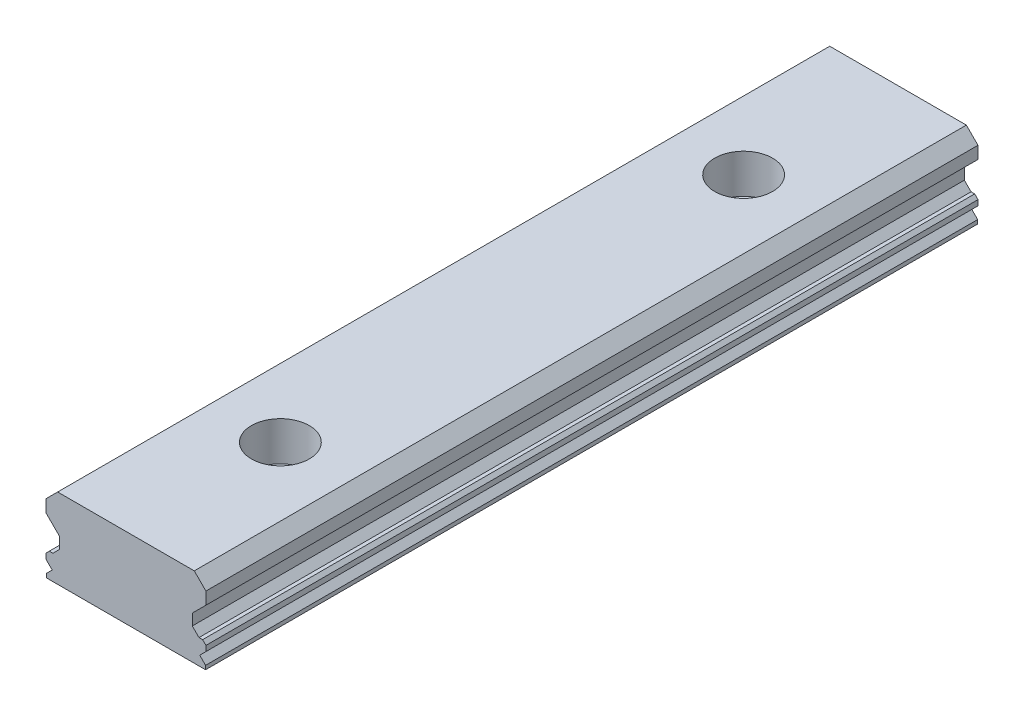
ISO-10303-21;
HEADER;
FILE_DESCRIPTION(('STEP AP214'),'2;1');
FILE_NAME('part.step','',(''),(''),'','','');
FILE_SCHEMA(('AUTOMOTIVE_DESIGN { 1 0 10303 214 1 1 1 1 }'));
ENDSEC;
DATA;
#1=APPLICATION_CONTEXT('core data for automotive mechanical design processes');
#2=APPLICATION_PROTOCOL_DEFINITION('international standard','automotive_design',2000,#1);
#3=PRODUCT_CONTEXT('',#1,'mechanical');
#4=PRODUCT('Part','Part','',(#3));
#5=PRODUCT_RELATED_PRODUCT_CATEGORY('part','',(#4));
#6=PRODUCT_DEFINITION_FORMATION('','',#4);
#7=PRODUCT_DEFINITION_CONTEXT('part definition',#1,'design');
#8=PRODUCT_DEFINITION('design','',#6,#7);
#9=PRODUCT_DEFINITION_SHAPE('','',#8);
#10=(LENGTH_UNIT() NAMED_UNIT(*) SI_UNIT(.MILLI.,.METRE.));
#11=(NAMED_UNIT(*) PLANE_ANGLE_UNIT() SI_UNIT($,.RADIAN.));
#12=(NAMED_UNIT(*) SI_UNIT($,.STERADIAN.) SOLID_ANGLE_UNIT());
#13=UNCERTAINTY_MEASURE_WITH_UNIT(LENGTH_MEASURE(1.E-05),#10,'distance_accuracy_value','');
#14=(GEOMETRIC_REPRESENTATION_CONTEXT(3) GLOBAL_UNCERTAINTY_ASSIGNED_CONTEXT((#13)) GLOBAL_UNIT_ASSIGNED_CONTEXT((#10,
#11,#12)) REPRESENTATION_CONTEXT('',''));
#15=CARTESIAN_POINT('',(0.,0.,0.));
#16=DIRECTION('',(0.,0.,1.));
#17=DIRECTION('',(1.,0.,0.));
#18=AXIS2_PLACEMENT_3D('',#15,#16,#17);
#19=CARTESIAN_POINT('',(-10.3131559924218,-5.07905707397295,100.));
#20=DIRECTION('',(0.,1.,0.));
#21=DIRECTION('',(0.,0.,1.));
#22=AXIS2_PLACEMENT_3D('',#19,#20,#21);
#23=PLANE('',#22);
#24=CARTESIAN_POINT('',(0.,-5.07905707397295,20.));
#25=DIRECTION('',(0.,1.,0.));
#26=DIRECTION('',(0.,0.,1.));
#27=AXIS2_PLACEMENT_3D('',#24,#25,#26);
#28=CIRCLE('',#27,2.25);
#29=CARTESIAN_POINT('',(0.,-5.07905707397295,22.25));
#30=VERTEX_POINT('',#29);
#31=EDGE_CURVE('E421',#30,#30,#28,.T.);
#32=ORIENTED_EDGE('',*,*,#31,.T.);
#33=EDGE_LOOP('',(#32));
#34=FACE_BOUND('',#33,.T.);
#35=CARTESIAN_POINT('',(0.,-5.07905707397295,80.));
#36=DIRECTION('',(0.,1.,0.));
#37=DIRECTION('',(0.,0.,1.));
#38=AXIS2_PLACEMENT_3D('',#35,#36,#37);
#39=CIRCLE('',#38,2.25);
#40=CARTESIAN_POINT('',(0.,-5.07905707397295,82.25));
#41=VERTEX_POINT('',#40);
#42=EDGE_CURVE('E424',#41,#41,#39,.T.);
#43=ORIENTED_EDGE('',*,*,#42,.T.);
#44=EDGE_LOOP('',(#43));
#45=FACE_BOUND('',#44,.T.);
#46=DIRECTION('',(1.,0.,0.));
#47=VECTOR('',#46,1.);
#48=CARTESIAN_POINT('',(-10.3131559924218,-5.07905707397295,0.));
#49=LINE('',#48,#47);
#50=CARTESIAN_POINT('',(-10.3131559924218,-5.07905707397295,0.));
#51=VERTEX_POINT('',#50);
#52=CARTESIAN_POINT('',(10.3131559924218,-5.07905707397295,0.));
#53=VERTEX_POINT('',#52);
#54=EDGE_CURVE('E228',#51,#53,#49,.T.);
#55=ORIENTED_EDGE('',*,*,#54,.T.);
#56=DIRECTION('',(0.,0.,-1.));
#57=VECTOR('',#56,1.);
#58=CARTESIAN_POINT('',(10.3131559924218,-5.07905707397295,100.));
#59=LINE('',#58,#57);
#60=CARTESIAN_POINT('',(10.3131559924218,-5.07905707397295,100.));
#61=VERTEX_POINT('',#60);
#62=EDGE_CURVE('E12',#61,#53,#59,.T.);
#63=ORIENTED_EDGE('',*,*,#62,.F.);
#64=DIRECTION('',(1.,0.,0.));
#65=VECTOR('',#64,1.);
#66=CARTESIAN_POINT('',(-10.3131559924218,-5.07905707397295,100.));
#67=LINE('',#66,#65);
#68=CARTESIAN_POINT('',(-10.3131559924218,-5.07905707397295,100.));
#69=VERTEX_POINT('',#68);
#70=EDGE_CURVE('E275',#69,#61,#67,.T.);
#71=ORIENTED_EDGE('',*,*,#70,.F.);
#72=DIRECTION('',(0.,0.,-1.));
#73=VECTOR('',#72,1.);
#74=CARTESIAN_POINT('',(-10.3131559924218,-5.07905707397295,100.));
#75=LINE('',#74,#73);
#76=EDGE_CURVE('E224',#69,#51,#75,.T.);
#77=ORIENTED_EDGE('',*,*,#76,.T.);
#78=EDGE_LOOP('',(#55,#63,#71,#77));
#79=FACE_BOUND('',#78,.T.);
#80=ADVANCED_FACE('F36',(#34,#45,#79),#23,.F.);
#81=CARTESIAN_POINT('',(10.3131559924218,-5.07905707397295,100.));
#82=DIRECTION('',(-1.,0.,0.));
#83=DIRECTION('',(0.,0.,1.));
#84=AXIS2_PLACEMENT_3D('',#81,#82,#83);
#85=PLANE('',#84);
#86=DIRECTION('',(0.,1.,0.));
#87=VECTOR('',#86,1.);
#88=CARTESIAN_POINT('',(10.3131559924218,-5.07905707397295,0.));
#89=LINE('',#88,#87);
#90=CARTESIAN_POINT('',(10.3131559924218,-4.57905707397295,0.));
#91=VERTEX_POINT('',#90);
#92=EDGE_CURVE('E231',#53,#91,#89,.T.);
#93=ORIENTED_EDGE('',*,*,#92,.T.);
#94=DIRECTION('',(0.,0.,-1.));
#95=VECTOR('',#94,1.);
#96=CARTESIAN_POINT('',(10.3131559924218,-4.57905707397295,100.));
#97=LINE('',#96,#95);
#98=CARTESIAN_POINT('',(10.3131559924218,-4.57905707397295,100.));
#99=VERTEX_POINT('',#98);
#100=EDGE_CURVE('E44',#99,#91,#97,.T.);
#101=ORIENTED_EDGE('',*,*,#100,.F.);
#102=DIRECTION('',(0.,1.,0.));
#103=VECTOR('',#102,1.);
#104=CARTESIAN_POINT('',(10.3131559924218,-5.07905707397295,100.));
#105=LINE('',#104,#103);
#106=EDGE_CURVE('E143',#61,#99,#105,.T.);
#107=ORIENTED_EDGE('',*,*,#106,.F.);
#108=ORIENTED_EDGE('',*,*,#62,.T.);
#109=EDGE_LOOP('',(#93,#101,#107,#108));
#110=FACE_BOUND('',#109,.T.);
#111=ADVANCED_FACE('F413',(#110),#85,.F.);
#112=CARTESIAN_POINT('',(10.3131559924218,-4.57905707397295,100.));
#113=DIRECTION('',(-0.707106781186549,-0.707106781186546,0.));
#114=DIRECTION('',(0.707106781186546,-0.707106781186549,0.));
#115=AXIS2_PLACEMENT_3D('',#112,#113,#114);
#116=PLANE('',#115);
#117=DIRECTION('',(-0.707106781186546,0.707106781186549,0.));
#118=VECTOR('',#117,1.);
#119=CARTESIAN_POINT('',(10.3131559924218,-4.57905707397295,0.));
#120=LINE('',#119,#118);
#121=CARTESIAN_POINT('',(9.55425294620379,-3.82015402775489,0.));
#122=VERTEX_POINT('',#121);
#123=EDGE_CURVE('E234',#91,#122,#120,.T.);
#124=ORIENTED_EDGE('',*,*,#123,.T.);
#125=DIRECTION('',(0.,0.,-1.));
#126=VECTOR('',#125,1.);
#127=CARTESIAN_POINT('',(9.55425294620379,-3.82015402775489,100.));
#128=LINE('',#127,#126);
#129=CARTESIAN_POINT('',(9.55425294620379,-3.82015402775489,100.));
#130=VERTEX_POINT('',#129);
#131=EDGE_CURVE('E330',#130,#122,#128,.T.);
#132=ORIENTED_EDGE('',*,*,#131,.F.);
#133=DIRECTION('',(-0.707106781186546,0.707106781186549,0.));
#134=VECTOR('',#133,1.);
#135=CARTESIAN_POINT('',(10.3131559924218,-4.57905707397295,100.));
#136=LINE('',#135,#134);
#137=EDGE_CURVE('E338',#99,#130,#136,.T.);
#138=ORIENTED_EDGE('',*,*,#137,.F.);
#139=ORIENTED_EDGE('',*,*,#100,.T.);
#140=EDGE_LOOP('',(#124,#132,#138,#139));
#141=FACE_BOUND('',#140,.T.);
#142=ADVANCED_FACE('F336',(#141),#116,.F.);
#143=CARTESIAN_POINT('',(9.55425294620379,-3.82015402775489,100.));
#144=DIRECTION('',(-0.707106781186548,0.707106781186547,0.));
#145=DIRECTION('',(-0.707106781186547,-0.707106781186548,0.));
#146=AXIS2_PLACEMENT_3D('',#143,#144,#145);
#147=PLANE('',#146);
#148=DIRECTION('',(0.707106781186547,0.707106781186548,0.));
#149=VECTOR('',#148,1.);
#150=CARTESIAN_POINT('',(9.55425294620379,-3.82015402775489,0.));
#151=LINE('',#150,#149);
#152=CARTESIAN_POINT('',(10.3561460451527,-3.01826092880601,0.));
#153=VERTEX_POINT('',#152);
#154=EDGE_CURVE('E236',#122,#153,#151,.T.);
#155=ORIENTED_EDGE('',*,*,#154,.T.);
#156=DIRECTION('',(0.,0.,-1.));
#157=VECTOR('',#156,1.);
#158=CARTESIAN_POINT('',(10.3561460451527,-3.01826092880601,100.));
#159=LINE('',#158,#157);
#160=CARTESIAN_POINT('',(10.3561460451527,-3.01826092880601,100.));
#161=VERTEX_POINT('',#160);
#162=EDGE_CURVE('E327',#161,#153,#159,.T.);
#163=ORIENTED_EDGE('',*,*,#162,.F.);
#164=DIRECTION('',(0.707106781186547,0.707106781186548,0.));
#165=VECTOR('',#164,1.);
#166=CARTESIAN_POINT('',(9.55425294620379,-3.82015402775489,100.));
#167=LINE('',#166,#165);
#168=EDGE_CURVE('E356',#130,#161,#167,.T.);
#169=ORIENTED_EDGE('',*,*,#168,.F.);
#170=ORIENTED_EDGE('',*,*,#131,.T.);
#171=EDGE_LOOP('',(#155,#163,#169,#170));
#172=FACE_BOUND('',#171,.T.);
#173=ADVANCED_FACE('F347',(#172),#147,.F.);
#174=CARTESIAN_POINT('',(10.3561460451527,-3.01826092880601,100.));
#175=DIRECTION('',(-1.,0.,0.));
#176=DIRECTION('',(0.,0.,1.));
#177=AXIS2_PLACEMENT_3D('',#174,#175,#176);
#178=PLANE('',#177);
#179=DIRECTION('',(0.,1.,0.));
#180=VECTOR('',#179,1.);
#181=CARTESIAN_POINT('',(10.3561460451527,-3.01826092880601,0.));
#182=LINE('',#181,#180);
#183=CARTESIAN_POINT('',(10.3561460451527,-2.32063772826459,0.));
#184=VERTEX_POINT('',#183);
#185=EDGE_CURVE('E238',#153,#184,#182,.T.);
#186=ORIENTED_EDGE('',*,*,#185,.T.);
#187=DIRECTION('',(0.,0.,-1.));
#188=VECTOR('',#187,1.);
#189=CARTESIAN_POINT('',(10.3561460451527,-2.32063772826459,100.));
#190=LINE('',#189,#188);
#191=CARTESIAN_POINT('',(10.3561460451527,-2.32063772826459,100.));
#192=VERTEX_POINT('',#191);
#193=EDGE_CURVE('E324',#192,#184,#190,.T.);
#194=ORIENTED_EDGE('',*,*,#193,.F.);
#195=DIRECTION('',(0.,1.,0.));
#196=VECTOR('',#195,1.);
#197=CARTESIAN_POINT('',(10.3561460451527,-3.01826092880601,100.));
#198=LINE('',#197,#196);
#199=EDGE_CURVE('E353',#161,#192,#198,.T.);
#200=ORIENTED_EDGE('',*,*,#199,.F.);
#201=ORIENTED_EDGE('',*,*,#162,.T.);
#202=EDGE_LOOP('',(#186,#194,#200,#201));
#203=FACE_BOUND('',#202,.T.);
#204=ADVANCED_FACE('F351',(#203),#178,.F.);
#205=CARTESIAN_POINT('',(10.3561460451527,-2.32063772826459,100.));
#206=DIRECTION('',(-0.707106781186546,-0.707106781186549,0.));
#207=DIRECTION('',(0.707106781186549,-0.707106781186546,0.));
#208=AXIS2_PLACEMENT_3D('',#205,#206,#207);
#209=PLANE('',#208);
#210=DIRECTION('',(-0.707106781186549,0.707106781186546,0.));
#211=VECTOR('',#210,1.);
#212=CARTESIAN_POINT('',(10.3561460451527,-2.32063772826459,0.));
#213=LINE('',#212,#211);
#214=CARTESIAN_POINT('',(9.92749896890732,-1.89199065201925,0.));
#215=VERTEX_POINT('',#214);
#216=EDGE_CURVE('E240',#184,#215,#213,.T.);
#217=ORIENTED_EDGE('',*,*,#216,.T.);
#218=DIRECTION('',(0.,0.,-1.));
#219=VECTOR('',#218,1.);
#220=CARTESIAN_POINT('',(9.92749896890732,-1.89199065201925,100.));
#221=LINE('',#220,#219);
#222=CARTESIAN_POINT('',(9.92749896890732,-1.89199065201925,100.));
#223=VERTEX_POINT('',#222);
#224=EDGE_CURVE('E321',#223,#215,#221,.T.);
#225=ORIENTED_EDGE('',*,*,#224,.F.);
#226=DIRECTION('',(-0.707106781186549,0.707106781186546,0.));
#227=VECTOR('',#226,1.);
#228=CARTESIAN_POINT('',(10.3561460451527,-2.32063772826459,100.));
#229=LINE('',#228,#227);
#230=EDGE_CURVE('E355',#192,#223,#229,.T.);
#231=ORIENTED_EDGE('',*,*,#230,.F.);
#232=ORIENTED_EDGE('',*,*,#193,.T.);
#233=EDGE_LOOP('',(#217,#225,#231,#232));
#234=FACE_BOUND('',#233,.T.);
#235=ADVANCED_FACE('F591',(#234),#209,.F.);
#236=CARTESIAN_POINT('',(9.92749896890732,-1.89199065201925,100.));
#237=DIRECTION('',(0.,-1.,0.));
#238=DIRECTION('',(0.,0.,-1.));
#239=AXIS2_PLACEMENT_3D('',#236,#237,#238);
#240=PLANE('',#239);
#241=DIRECTION('',(-1.,0.,0.));
#242=VECTOR('',#241,1.);
#243=CARTESIAN_POINT('',(9.92749896890732,-1.89199065201925,0.));
#244=LINE('',#243,#242);
#245=CARTESIAN_POINT('',(9.45946662844144,-1.89199065201925,0.));
#246=VERTEX_POINT('',#245);
#247=EDGE_CURVE('E242',#215,#246,#244,.T.);
#248=ORIENTED_EDGE('',*,*,#247,.T.);
#249=DIRECTION('',(0.,0.,-1.));
#250=VECTOR('',#249,1.);
#251=CARTESIAN_POINT('',(9.45946662844144,-1.89199065201925,100.));
#252=LINE('',#251,#250);
#253=CARTESIAN_POINT('',(9.45946662844144,-1.89199065201925,100.));
#254=VERTEX_POINT('',#253);
#255=EDGE_CURVE('E318',#254,#246,#252,.T.);
#256=ORIENTED_EDGE('',*,*,#255,.F.);
#257=DIRECTION('',(-1.,0.,0.));
#258=VECTOR('',#257,1.);
#259=CARTESIAN_POINT('',(9.92749896890732,-1.89199065201925,100.));
#260=LINE('',#259,#258);
#261=EDGE_CURVE('E358',#223,#254,#260,.T.);
#262=ORIENTED_EDGE('',*,*,#261,.F.);
#263=ORIENTED_EDGE('',*,*,#224,.T.);
#264=EDGE_LOOP('',(#248,#256,#262,#263));
#265=FACE_BOUND('',#264,.T.);
#266=ADVANCED_FACE('F588',(#265),#240,.F.);
#267=CARTESIAN_POINT('',(9.45946662844144,-1.89199065201925,100.));
#268=DIRECTION('',(-0.707106781186549,-0.707106781186547,0.));
#269=DIRECTION('',(0.707106781186547,-0.707106781186549,0.));
#270=AXIS2_PLACEMENT_3D('',#267,#268,#269);
#271=PLANE('',#270);
#272=DIRECTION('',(-0.707106781186546,0.707106781186549,0.));
#273=VECTOR('',#272,1.);
#274=CARTESIAN_POINT('',(9.45946662844144,-1.89199065201925,0.));
#275=LINE('',#274,#273);
#276=CARTESIAN_POINT('',(8.5918670125414,-1.0243910361192,0.));
#277=VERTEX_POINT('',#276);
#278=EDGE_CURVE('E244',#246,#277,#275,.T.);
#279=ORIENTED_EDGE('',*,*,#278,.T.);
#280=DIRECTION('',(0.,0.,-1.));
#281=VECTOR('',#280,1.);
#282=CARTESIAN_POINT('',(8.5918670125414,-1.0243910361192,100.));
#283=LINE('',#282,#281);
#284=CARTESIAN_POINT('',(8.5918670125414,-1.0243910361192,100.));
#285=VERTEX_POINT('',#284);
#286=EDGE_CURVE('E315',#285,#277,#283,.T.);
#287=ORIENTED_EDGE('',*,*,#286,.F.);
#288=DIRECTION('',(-0.707106781186546,0.707106781186549,0.));
#289=VECTOR('',#288,1.);
#290=CARTESIAN_POINT('',(9.45946662844144,-1.89199065201925,100.));
#291=LINE('',#290,#289);
#292=EDGE_CURVE('E364',#254,#285,#291,.T.);
#293=ORIENTED_EDGE('',*,*,#292,.F.);
#294=ORIENTED_EDGE('',*,*,#255,.T.);
#295=EDGE_LOOP('',(#279,#287,#293,#294));
#296=FACE_BOUND('',#295,.T.);
#297=ADVANCED_FACE('F583',(#296),#271,.F.);
#298=CARTESIAN_POINT('',(8.5918670125414,-1.0243910361192,100.));
#299=DIRECTION('',(-1.,0.,0.));
#300=DIRECTION('',(0.,0.,1.));
#301=AXIS2_PLACEMENT_3D('',#298,#299,#300);
#302=PLANE('',#301);
#303=DIRECTION('',(0.,1.,0.));
#304=VECTOR('',#303,1.);
#305=CARTESIAN_POINT('',(8.5918670125414,-1.0243910361192,0.));
#306=LINE('',#305,#304);
#307=CARTESIAN_POINT('',(8.5918670125414,0.420032400687811,0.));
#308=VERTEX_POINT('',#307);
#309=EDGE_CURVE('E246',#277,#308,#306,.T.);
#310=ORIENTED_EDGE('',*,*,#309,.T.);
#311=DIRECTION('',(0.,0.,-1.));
#312=VECTOR('',#311,1.);
#313=CARTESIAN_POINT('',(8.5918670125414,0.420032400687811,100.));
#314=LINE('',#313,#312);
#315=CARTESIAN_POINT('',(8.5918670125414,0.420032400687811,100.));
#316=VERTEX_POINT('',#315);
#317=EDGE_CURVE('E312',#316,#308,#314,.T.);
#318=ORIENTED_EDGE('',*,*,#317,.F.);
#319=DIRECTION('',(0.,1.,0.));
#320=VECTOR('',#319,1.);
#321=CARTESIAN_POINT('',(8.5918670125414,-1.0243910361192,100.));
#322=LINE('',#321,#320);
#323=EDGE_CURVE('E366',#285,#316,#322,.T.);
#324=ORIENTED_EDGE('',*,*,#323,.F.);
#325=ORIENTED_EDGE('',*,*,#286,.T.);
#326=EDGE_LOOP('',(#310,#318,#324,#325));
#327=FACE_BOUND('',#326,.T.);
#328=ADVANCED_FACE('F578',(#327),#302,.F.);
#329=CARTESIAN_POINT('',(8.5918670125414,0.420032400687811,100.));
#330=DIRECTION('',(-0.707106781186547,0.707106781186548,0.));
#331=DIRECTION('',(-0.707106781186548,-0.707106781186547,0.));
#332=AXIS2_PLACEMENT_3D('',#329,#330,#331);
#333=PLANE('',#332);
#334=DIRECTION('',(0.707106781186548,0.707106781186547,0.));
#335=VECTOR('',#334,1.);
#336=CARTESIAN_POINT('',(8.5918670125414,0.420032400687811,0.));
#337=LINE('',#336,#335);
#338=CARTESIAN_POINT('',(10.3561460451527,2.18431143329908,0.));
#339=VERTEX_POINT('',#338);
#340=EDGE_CURVE('E248',#308,#339,#337,.T.);
#341=ORIENTED_EDGE('',*,*,#340,.T.);
#342=DIRECTION('',(0.,0.,-1.));
#343=VECTOR('',#342,1.);
#344=CARTESIAN_POINT('',(10.3561460451527,2.18431143329908,100.));
#345=LINE('',#344,#343);
#346=CARTESIAN_POINT('',(10.3561460451527,2.18431143329908,100.));
#347=VERTEX_POINT('',#346);
#348=EDGE_CURVE('E309',#347,#339,#345,.T.);
#349=ORIENTED_EDGE('',*,*,#348,.F.);
#350=DIRECTION('',(0.707106781186548,0.707106781186547,0.));
#351=VECTOR('',#350,1.);
#352=CARTESIAN_POINT('',(8.5918670125414,0.420032400687811,100.));
#353=LINE('',#352,#351);
#354=EDGE_CURVE('E368',#316,#347,#353,.T.);
#355=ORIENTED_EDGE('',*,*,#354,.F.);
#356=ORIENTED_EDGE('',*,*,#317,.T.);
#357=EDGE_LOOP('',(#341,#349,#355,#356));
#358=FACE_BOUND('',#357,.T.);
#359=ADVANCED_FACE('F574',(#358),#333,.F.);
#360=CARTESIAN_POINT('',(10.3561460451527,2.18431143329908,100.));
#361=DIRECTION('',(-1.,0.,0.));
#362=DIRECTION('',(0.,-1.,0.));
#363=AXIS2_PLACEMENT_3D('',#360,#361,#362);
#364=PLANE('',#363);
#365=DIRECTION('',(0.,1.,0.));
#366=VECTOR('',#365,1.);
#367=CARTESIAN_POINT('',(10.3561460451527,2.18431143329908,0.));
#368=LINE('',#367,#366);
#369=CARTESIAN_POINT('',(10.3561460451527,3.77672605578153,0.));
#370=VERTEX_POINT('',#369);
#371=EDGE_CURVE('E250',#339,#370,#368,.T.);
#372=ORIENTED_EDGE('',*,*,#371,.T.);
#373=DIRECTION('',(0.,0.,-1.));
#374=VECTOR('',#373,1.);
#375=CARTESIAN_POINT('',(10.3561460451527,3.77672605578153,100.));
#376=LINE('',#375,#374);
#377=CARTESIAN_POINT('',(10.3561460451527,3.77672605578153,100.));
#378=VERTEX_POINT('',#377);
#379=EDGE_CURVE('E306',#378,#370,#376,.T.);
#380=ORIENTED_EDGE('',*,*,#379,.F.);
#381=DIRECTION('',(0.,1.,0.));
#382=VECTOR('',#381,1.);
#383=CARTESIAN_POINT('',(10.3561460451527,2.18431143329908,100.));
#384=LINE('',#383,#382);
#385=EDGE_CURVE('E370',#347,#378,#384,.T.);
#386=ORIENTED_EDGE('',*,*,#385,.F.);
#387=ORIENTED_EDGE('',*,*,#348,.T.);
#388=EDGE_LOOP('',(#372,#380,#386,#387));
#389=FACE_BOUND('',#388,.T.);
#390=ADVANCED_FACE('F570',(#389),#364,.F.);
#391=CARTESIAN_POINT('',(10.3561460451527,3.77672605578153,100.));
#392=DIRECTION('',(-0.707106781186548,-0.707106781186547,0.));
#393=DIRECTION('',(0.707106781186547,-0.707106781186548,0.));
#394=AXIS2_PLACEMENT_3D('',#391,#392,#393);
#395=PLANE('',#394);
#396=DIRECTION('',(-0.707106781186547,0.707106781186548,0.));
#397=VECTOR('',#396,1.);
#398=CARTESIAN_POINT('',(10.3561460451527,3.77672605578153,0.));
#399=LINE('',#398,#397);
#400=CARTESIAN_POINT('',(8.84781244645144,5.28505965448277,0.));
#401=VERTEX_POINT('',#400);
#402=EDGE_CURVE('E252',#370,#401,#399,.T.);
#403=ORIENTED_EDGE('',*,*,#402,.T.);
#404=DIRECTION('',(0.,0.,-1.));
#405=VECTOR('',#404,1.);
#406=CARTESIAN_POINT('',(8.84781244645144,5.28505965448277,100.));
#407=LINE('',#406,#405);
#408=CARTESIAN_POINT('',(8.84781244645144,5.28505965448277,100.));
#409=VERTEX_POINT('',#408);
#410=EDGE_CURVE('E303',#409,#401,#407,.T.);
#411=ORIENTED_EDGE('',*,*,#410,.F.);
#412=DIRECTION('',(-0.707106781186547,0.707106781186548,0.));
#413=VECTOR('',#412,1.);
#414=CARTESIAN_POINT('',(10.3561460451527,3.77672605578153,100.));
#415=LINE('',#414,#413);
#416=EDGE_CURVE('E372',#378,#409,#415,.T.);
#417=ORIENTED_EDGE('',*,*,#416,.F.);
#418=ORIENTED_EDGE('',*,*,#379,.T.);
#419=EDGE_LOOP('',(#403,#411,#417,#418));
#420=FACE_BOUND('',#419,.T.);
#421=ADVANCED_FACE('F536',(#420),#395,.F.);
#422=CARTESIAN_POINT('',(8.84781244645144,5.28505965448277,100.));
#423=DIRECTION('',(0.,-1.,0.));
#424=DIRECTION('',(0.,0.,-1.));
#425=AXIS2_PLACEMENT_3D('',#422,#423,#424);
#426=PLANE('',#425);
#427=CARTESIAN_POINT('',(0.,5.28505965448277,20.));
#428=DIRECTION('',(0.,1.,0.));
#429=DIRECTION('',(0.,0.,1.));
#430=AXIS2_PLACEMENT_3D('',#427,#428,#429);
#431=CIRCLE('',#430,3.75);
#432=CARTESIAN_POINT('',(0.,5.28505965448277,23.75));
#433=VERTEX_POINT('',#432);
#434=EDGE_CURVE('E435',#433,#433,#431,.T.);
#435=ORIENTED_EDGE('',*,*,#434,.F.);
#436=EDGE_LOOP('',(#435));
#437=FACE_BOUND('',#436,.T.);
#438=CARTESIAN_POINT('',(0.,5.28505965448277,80.));
#439=DIRECTION('',(0.,1.,0.));
#440=DIRECTION('',(0.,0.,1.));
#441=AXIS2_PLACEMENT_3D('',#438,#439,#440);
#442=CIRCLE('',#441,3.75);
#443=CARTESIAN_POINT('',(0.,5.28505965448277,83.75));
#444=VERTEX_POINT('',#443);
#445=EDGE_CURVE('E441',#444,#444,#442,.T.);
#446=ORIENTED_EDGE('',*,*,#445,.F.);
#447=EDGE_LOOP('',(#446));
#448=FACE_BOUND('',#447,.T.);
#449=DIRECTION('',(-1.,0.,0.));
#450=VECTOR('',#449,1.);
#451=CARTESIAN_POINT('',(8.84781244645144,5.28505965448277,0.));
#452=LINE('',#451,#450);
#453=CARTESIAN_POINT('',(-8.84781244645144,5.28505965448277,0.));
#454=VERTEX_POINT('',#453);
#455=EDGE_CURVE('E254',#401,#454,#452,.T.);
#456=ORIENTED_EDGE('',*,*,#455,.T.);
#457=DIRECTION('',(0.,0.,-1.));
#458=VECTOR('',#457,1.);
#459=CARTESIAN_POINT('',(-8.84781244645144,5.28505965448277,100.));
#460=LINE('',#459,#458);
#461=CARTESIAN_POINT('',(-8.84781244645144,5.28505965448277,100.));
#462=VERTEX_POINT('',#461);
#463=EDGE_CURVE('E300',#462,#454,#460,.T.);
#464=ORIENTED_EDGE('',*,*,#463,.F.);
#465=DIRECTION('',(-1.,0.,0.));
#466=VECTOR('',#465,1.);
#467=CARTESIAN_POINT('',(8.84781244645144,5.28505965448277,100.));
#468=LINE('',#467,#466);
#469=EDGE_CURVE('E374',#409,#462,#468,.T.);
#470=ORIENTED_EDGE('',*,*,#469,.F.);
#471=ORIENTED_EDGE('',*,*,#410,.T.);
#472=EDGE_LOOP('',(#456,#464,#470,#471));
#473=FACE_BOUND('',#472,.T.);
#474=ADVANCED_FACE('F483',(#437,#448,#473),#426,.F.);
#475=CARTESIAN_POINT('',(-8.84781244645144,5.28505965448277,100.));
#476=DIRECTION('',(0.707106781186548,-0.707106781186547,0.));
#477=DIRECTION('',(0.707106781186547,0.707106781186548,0.));
#478=AXIS2_PLACEMENT_3D('',#475,#476,#477);
#479=PLANE('',#478);
#480=DIRECTION('',(-0.707106781186547,-0.707106781186548,0.));
#481=VECTOR('',#480,1.);
#482=CARTESIAN_POINT('',(-8.84781244645144,5.28505965448277,0.));
#483=LINE('',#482,#481);
#484=CARTESIAN_POINT('',(-10.3561460451527,3.77672605578153,0.));
#485=VERTEX_POINT('',#484);
#486=EDGE_CURVE('E256',#454,#485,#483,.T.);
#487=ORIENTED_EDGE('',*,*,#486,.T.);
#488=DIRECTION('',(0.,0.,-1.));
#489=VECTOR('',#488,1.);
#490=CARTESIAN_POINT('',(-10.3561460451527,3.77672605578153,100.));
#491=LINE('',#490,#489);
#492=CARTESIAN_POINT('',(-10.3561460451527,3.77672605578153,100.));
#493=VERTEX_POINT('',#492);
#494=EDGE_CURVE('E297',#493,#485,#491,.T.);
#495=ORIENTED_EDGE('',*,*,#494,.F.);
#496=DIRECTION('',(-0.707106781186547,-0.707106781186548,0.));
#497=VECTOR('',#496,1.);
#498=CARTESIAN_POINT('',(-8.84781244645144,5.28505965448277,100.));
#499=LINE('',#498,#497);
#500=EDGE_CURVE('E376',#462,#493,#499,.T.);
#501=ORIENTED_EDGE('',*,*,#500,.F.);
#502=ORIENTED_EDGE('',*,*,#463,.T.);
#503=EDGE_LOOP('',(#487,#495,#501,#502));
#504=FACE_BOUND('',#503,.T.);
#505=ADVANCED_FACE('F535',(#504),#479,.F.);
#506=CARTESIAN_POINT('',(-10.3561460451527,3.77672605578153,100.));
#507=DIRECTION('',(1.,0.,0.));
#508=DIRECTION('',(0.,1.,0.));
#509=AXIS2_PLACEMENT_3D('',#506,#507,#508);
#510=PLANE('',#509);
#511=DIRECTION('',(0.,-1.,0.));
#512=VECTOR('',#511,1.);
#513=CARTESIAN_POINT('',(-10.3561460451527,3.77672605578153,0.));
#514=LINE('',#513,#512);
#515=CARTESIAN_POINT('',(-10.3561460451527,2.18431143329908,0.));
#516=VERTEX_POINT('',#515);
#517=EDGE_CURVE('E258',#485,#516,#514,.T.);
#518=ORIENTED_EDGE('',*,*,#517,.T.);
#519=DIRECTION('',(0.,0.,-1.));
#520=VECTOR('',#519,1.);
#521=CARTESIAN_POINT('',(-10.3561460451527,2.18431143329908,100.));
#522=LINE('',#521,#520);
#523=CARTESIAN_POINT('',(-10.3561460451527,2.18431143329908,100.));
#524=VERTEX_POINT('',#523);
#525=EDGE_CURVE('E294',#524,#516,#522,.T.);
#526=ORIENTED_EDGE('',*,*,#525,.F.);
#527=DIRECTION('',(0.,-1.,0.));
#528=VECTOR('',#527,1.);
#529=CARTESIAN_POINT('',(-10.3561460451527,3.77672605578153,100.));
#530=LINE('',#529,#528);
#531=EDGE_CURVE('E378',#493,#524,#530,.T.);
#532=ORIENTED_EDGE('',*,*,#531,.F.);
#533=ORIENTED_EDGE('',*,*,#494,.T.);
#534=EDGE_LOOP('',(#518,#526,#532,#533));
#535=FACE_BOUND('',#534,.T.);
#536=ADVANCED_FACE('F554',(#535),#510,.F.);
#537=CARTESIAN_POINT('',(-10.3561460451527,2.18431143329908,100.));
#538=DIRECTION('',(0.707106781186547,0.707106781186548,0.));
#539=DIRECTION('',(-0.707106781186548,0.707106781186547,0.));
#540=AXIS2_PLACEMENT_3D('',#537,#538,#539);
#541=PLANE('',#540);
#542=DIRECTION('',(0.707106781186548,-0.707106781186547,0.));
#543=VECTOR('',#542,1.);
#544=CARTESIAN_POINT('',(-10.3561460451527,2.18431143329908,0.));
#545=LINE('',#544,#543);
#546=CARTESIAN_POINT('',(-8.5918670125414,0.420032400687808,0.));
#547=VERTEX_POINT('',#546);
#548=EDGE_CURVE('E260',#516,#547,#545,.T.);
#549=ORIENTED_EDGE('',*,*,#548,.T.);
#550=DIRECTION('',(0.,0.,-1.));
#551=VECTOR('',#550,1.);
#552=CARTESIAN_POINT('',(-8.5918670125414,0.420032400687808,100.));
#553=LINE('',#552,#551);
#554=CARTESIAN_POINT('',(-8.5918670125414,0.420032400687808,100.));
#555=VERTEX_POINT('',#554);
#556=EDGE_CURVE('E291',#555,#547,#553,.T.);
#557=ORIENTED_EDGE('',*,*,#556,.F.);
#558=DIRECTION('',(0.707106781186548,-0.707106781186547,0.));
#559=VECTOR('',#558,1.);
#560=CARTESIAN_POINT('',(-10.3561460451527,2.18431143329908,100.));
#561=LINE('',#560,#559);
#562=EDGE_CURVE('E380',#524,#555,#561,.T.);
#563=ORIENTED_EDGE('',*,*,#562,.F.);
#564=ORIENTED_EDGE('',*,*,#525,.T.);
#565=EDGE_LOOP('',(#549,#557,#563,#564));
#566=FACE_BOUND('',#565,.T.);
#567=ADVANCED_FACE('F558',(#566),#541,.F.);
#568=CARTESIAN_POINT('',(-8.5918670125414,0.420032400687808,100.));
#569=DIRECTION('',(1.,0.,0.));
#570=DIRECTION('',(0.,0.,-1.));
#571=AXIS2_PLACEMENT_3D('',#568,#569,#570);
#572=PLANE('',#571);
#573=DIRECTION('',(0.,-1.,0.));
#574=VECTOR('',#573,1.);
#575=CARTESIAN_POINT('',(-8.5918670125414,0.420032400687808,0.));
#576=LINE('',#575,#574);
#577=CARTESIAN_POINT('',(-8.5918670125414,-1.0243910361192,0.));
#578=VERTEX_POINT('',#577);
#579=EDGE_CURVE('E262',#547,#578,#576,.T.);
#580=ORIENTED_EDGE('',*,*,#579,.T.);
#581=DIRECTION('',(0.,0.,-1.));
#582=VECTOR('',#581,1.);
#583=CARTESIAN_POINT('',(-8.5918670125414,-1.0243910361192,100.));
#584=LINE('',#583,#582);
#585=CARTESIAN_POINT('',(-8.5918670125414,-1.0243910361192,100.));
#586=VERTEX_POINT('',#585);
#587=EDGE_CURVE('E288',#586,#578,#584,.T.);
#588=ORIENTED_EDGE('',*,*,#587,.F.);
#589=DIRECTION('',(0.,-1.,0.));
#590=VECTOR('',#589,1.);
#591=CARTESIAN_POINT('',(-8.5918670125414,0.420032400687808,100.));
#592=LINE('',#591,#590);
#593=EDGE_CURVE('E382',#555,#586,#592,.T.);
#594=ORIENTED_EDGE('',*,*,#593,.F.);
#595=ORIENTED_EDGE('',*,*,#556,.T.);
#596=EDGE_LOOP('',(#580,#588,#594,#595));
#597=FACE_BOUND('',#596,.T.);
#598=ADVANCED_FACE('F691',(#597),#572,.F.);
#599=CARTESIAN_POINT('',(-8.5918670125414,-1.0243910361192,100.));
#600=DIRECTION('',(0.707106781186549,-0.707106781186547,0.));
#601=DIRECTION('',(0.707106781186547,0.707106781186549,0.));
#602=AXIS2_PLACEMENT_3D('',#599,#600,#601);
#603=PLANE('',#602);
#604=DIRECTION('',(-0.707106781186546,-0.707106781186549,0.));
#605=VECTOR('',#604,1.);
#606=CARTESIAN_POINT('',(-8.5918670125414,-1.0243910361192,0.));
#607=LINE('',#606,#605);
#608=CARTESIAN_POINT('',(-9.45946662844144,-1.89199065201925,0.));
#609=VERTEX_POINT('',#608);
#610=EDGE_CURVE('E264',#578,#609,#607,.T.);
#611=ORIENTED_EDGE('',*,*,#610,.T.);
#612=DIRECTION('',(0.,0.,-1.));
#613=VECTOR('',#612,1.);
#614=CARTESIAN_POINT('',(-9.45946662844144,-1.89199065201925,100.));
#615=LINE('',#614,#613);
#616=CARTESIAN_POINT('',(-9.45946662844144,-1.89199065201925,100.));
#617=VERTEX_POINT('',#616);
#618=EDGE_CURVE('E285',#617,#609,#615,.T.);
#619=ORIENTED_EDGE('',*,*,#618,.F.);
#620=DIRECTION('',(-0.707106781186546,-0.707106781186549,0.));
#621=VECTOR('',#620,1.);
#622=CARTESIAN_POINT('',(-8.5918670125414,-1.0243910361192,100.));
#623=LINE('',#622,#621);
#624=EDGE_CURVE('E384',#586,#617,#623,.T.);
#625=ORIENTED_EDGE('',*,*,#624,.F.);
#626=ORIENTED_EDGE('',*,*,#587,.T.);
#627=EDGE_LOOP('',(#611,#619,#625,#626));
#628=FACE_BOUND('',#627,.T.);
#629=ADVANCED_FACE('F700',(#628),#603,.F.);
#630=CARTESIAN_POINT('',(-9.45946662844144,-1.89199065201925,100.));
#631=DIRECTION('',(0.,-1.,0.));
#632=DIRECTION('',(1.,0.,0.));
#633=AXIS2_PLACEMENT_3D('',#630,#631,#632);
#634=PLANE('',#633);
#635=DIRECTION('',(-1.,0.,0.));
#636=VECTOR('',#635,1.);
#637=CARTESIAN_POINT('',(-9.45946662844144,-1.89199065201925,0.));
#638=LINE('',#637,#636);
#639=CARTESIAN_POINT('',(-9.92749896890732,-1.89199065201925,0.));
#640=VERTEX_POINT('',#639);
#641=EDGE_CURVE('E266',#609,#640,#638,.T.);
#642=ORIENTED_EDGE('',*,*,#641,.T.);
#643=DIRECTION('',(0.,0.,-1.));
#644=VECTOR('',#643,1.);
#645=CARTESIAN_POINT('',(-9.92749896890732,-1.89199065201925,100.));
#646=LINE('',#645,#644);
#647=CARTESIAN_POINT('',(-9.92749896890732,-1.89199065201925,100.));
#648=VERTEX_POINT('',#647);
#649=EDGE_CURVE('E282',#648,#640,#646,.T.);
#650=ORIENTED_EDGE('',*,*,#649,.F.);
#651=DIRECTION('',(-1.,0.,0.));
#652=VECTOR('',#651,1.);
#653=CARTESIAN_POINT('',(-9.45946662844144,-1.89199065201925,100.));
#654=LINE('',#653,#652);
#655=EDGE_CURVE('E386',#617,#648,#654,.T.);
#656=ORIENTED_EDGE('',*,*,#655,.F.);
#657=ORIENTED_EDGE('',*,*,#618,.T.);
#658=EDGE_LOOP('',(#642,#650,#656,#657));
#659=FACE_BOUND('',#658,.T.);
#660=ADVANCED_FACE('F710',(#659),#634,.F.);
#661=CARTESIAN_POINT('',(-9.92749896890732,-1.89199065201925,100.));
#662=DIRECTION('',(0.707106781186547,-0.707106781186548,0.));
#663=DIRECTION('',(0.707106781186548,0.707106781186547,0.));
#664=AXIS2_PLACEMENT_3D('',#661,#662,#663);
#665=PLANE('',#664);
#666=DIRECTION('',(-0.707106781186548,-0.707106781186547,0.));
#667=VECTOR('',#666,1.);
#668=CARTESIAN_POINT('',(-9.92749896890732,-1.89199065201925,0.));
#669=LINE('',#668,#667);
#670=CARTESIAN_POINT('',(-10.3561460451527,-2.3206377282646,0.));
#671=VERTEX_POINT('',#670);
#672=EDGE_CURVE('E268',#640,#671,#669,.T.);
#673=ORIENTED_EDGE('',*,*,#672,.T.);
#674=DIRECTION('',(0.,0.,-1.));
#675=VECTOR('',#674,1.);
#676=CARTESIAN_POINT('',(-10.3561460451527,-2.3206377282646,100.));
#677=LINE('',#676,#675);
#678=CARTESIAN_POINT('',(-10.3561460451527,-2.3206377282646,100.));
#679=VERTEX_POINT('',#678);
#680=EDGE_CURVE('E279',#679,#671,#677,.T.);
#681=ORIENTED_EDGE('',*,*,#680,.F.);
#682=DIRECTION('',(-0.707106781186548,-0.707106781186547,0.));
#683=VECTOR('',#682,1.);
#684=CARTESIAN_POINT('',(-9.92749896890732,-1.89199065201925,100.));
#685=LINE('',#684,#683);
#686=EDGE_CURVE('E388',#648,#679,#685,.T.);
#687=ORIENTED_EDGE('',*,*,#686,.F.);
#688=ORIENTED_EDGE('',*,*,#649,.T.);
#689=EDGE_LOOP('',(#673,#681,#687,#688));
#690=FACE_BOUND('',#689,.T.);
#691=ADVANCED_FACE('F394',(#690),#665,.F.);
#692=CARTESIAN_POINT('',(-10.3561460451527,-2.3206377282646,100.));
#693=DIRECTION('',(1.,0.,0.));
#694=DIRECTION('',(0.,0.,-1.));
#695=AXIS2_PLACEMENT_3D('',#692,#693,#694);
#696=PLANE('',#695);
#697=DIRECTION('',(0.,-1.,0.));
#698=VECTOR('',#697,1.);
#699=CARTESIAN_POINT('',(-10.3561460451527,-2.3206377282646,0.));
#700=LINE('',#699,#698);
#701=CARTESIAN_POINT('',(-10.3561460451527,-3.01826092880602,0.));
#702=VERTEX_POINT('',#701);
#703=EDGE_CURVE('E270',#671,#702,#700,.T.);
#704=ORIENTED_EDGE('',*,*,#703,.T.);
#705=DIRECTION('',(0.,0.,-1.));
#706=VECTOR('',#705,1.);
#707=CARTESIAN_POINT('',(-10.3561460451527,-3.01826092880602,100.));
#708=LINE('',#707,#706);
#709=CARTESIAN_POINT('',(-10.3561460451527,-3.01826092880602,100.));
#710=VERTEX_POINT('',#709);
#711=EDGE_CURVE('E219',#710,#702,#708,.T.);
#712=ORIENTED_EDGE('',*,*,#711,.F.);
#713=DIRECTION('',(0.,-1.,0.));
#714=VECTOR('',#713,1.);
#715=CARTESIAN_POINT('',(-10.3561460451527,-2.3206377282646,100.));
#716=LINE('',#715,#714);
#717=EDGE_CURVE('E210',#679,#710,#716,.T.);
#718=ORIENTED_EDGE('',*,*,#717,.F.);
#719=ORIENTED_EDGE('',*,*,#680,.T.);
#720=EDGE_LOOP('',(#704,#712,#718,#719));
#721=FACE_BOUND('',#720,.T.);
#722=ADVANCED_FACE('F398',(#721),#696,.F.);
#723=CARTESIAN_POINT('',(-10.3561460451527,-3.01826092880602,100.));
#724=DIRECTION('',(0.707106781186548,0.707106781186547,0.));
#725=DIRECTION('',(-0.707106781186547,0.707106781186548,0.));
#726=AXIS2_PLACEMENT_3D('',#723,#724,#725);
#727=PLANE('',#726);
#728=DIRECTION('',(0.707106781186547,-0.707106781186548,0.));
#729=VECTOR('',#728,1.);
#730=CARTESIAN_POINT('',(-10.3561460451527,-3.01826092880602,0.));
#731=LINE('',#730,#729);
#732=CARTESIAN_POINT('',(-9.55425294620379,-3.8201540277549,0.));
#733=VERTEX_POINT('',#732);
#734=EDGE_CURVE('E218',#702,#733,#731,.T.);
#735=ORIENTED_EDGE('',*,*,#734,.T.);
#736=DIRECTION('',(0.,0.,-1.));
#737=VECTOR('',#736,1.);
#738=CARTESIAN_POINT('',(-9.55425294620379,-3.8201540277549,100.));
#739=LINE('',#738,#737);
#740=CARTESIAN_POINT('',(-9.55425294620379,-3.8201540277549,100.));
#741=VERTEX_POINT('',#740);
#742=EDGE_CURVE('E215',#741,#733,#739,.T.);
#743=ORIENTED_EDGE('',*,*,#742,.F.);
#744=DIRECTION('',(0.707106781186547,-0.707106781186548,0.));
#745=VECTOR('',#744,1.);
#746=CARTESIAN_POINT('',(-10.3561460451527,-3.01826092880602,100.));
#747=LINE('',#746,#745);
#748=EDGE_CURVE('E204',#710,#741,#747,.T.);
#749=ORIENTED_EDGE('',*,*,#748,.F.);
#750=ORIENTED_EDGE('',*,*,#711,.T.);
#751=EDGE_LOOP('',(#735,#743,#749,#750));
#752=FACE_BOUND('',#751,.T.);
#753=ADVANCED_FACE('F216',(#752),#727,.F.);
#754=CARTESIAN_POINT('',(-9.55425294620379,-3.8201540277549,100.));
#755=DIRECTION('',(0.707106781186549,-0.707106781186546,0.));
#756=DIRECTION('',(0.707106781186546,0.707106781186549,0.));
#757=AXIS2_PLACEMENT_3D('',#754,#755,#756);
#758=PLANE('',#757);
#759=DIRECTION('',(-0.707106781186546,-0.707106781186549,0.));
#760=VECTOR('',#759,1.);
#761=CARTESIAN_POINT('',(-9.55425294620379,-3.8201540277549,0.));
#762=LINE('',#761,#760);
#763=CARTESIAN_POINT('',(-10.3131559924218,-4.57905707397295,0.));
#764=VERTEX_POINT('',#763);
#765=EDGE_CURVE('E129',#733,#764,#762,.T.);
#766=ORIENTED_EDGE('',*,*,#765,.T.);
#767=DIRECTION('',(0.,0.,-1.));
#768=VECTOR('',#767,1.);
#769=CARTESIAN_POINT('',(-10.3131559924218,-4.57905707397295,100.));
#770=LINE('',#769,#768);
#771=CARTESIAN_POINT('',(-10.3131559924218,-4.57905707397295,100.));
#772=VERTEX_POINT('',#771);
#773=EDGE_CURVE('E220',#772,#764,#770,.T.);
#774=ORIENTED_EDGE('',*,*,#773,.F.);
#775=DIRECTION('',(-0.707106781186546,-0.707106781186549,0.));
#776=VECTOR('',#775,1.);
#777=CARTESIAN_POINT('',(-9.55425294620379,-3.8201540277549,100.));
#778=LINE('',#777,#776);
#779=EDGE_CURVE('E208',#741,#772,#778,.T.);
#780=ORIENTED_EDGE('',*,*,#779,.F.);
#781=ORIENTED_EDGE('',*,*,#742,.T.);
#782=EDGE_LOOP('',(#766,#774,#780,#781));
#783=FACE_BOUND('',#782,.T.);
#784=ADVANCED_FACE('F222',(#783),#758,.F.);
#785=CARTESIAN_POINT('',(-10.3131559924218,-4.57905707397295,100.));
#786=DIRECTION('',(1.,0.,0.));
#787=DIRECTION('',(0.,0.,-1.));
#788=AXIS2_PLACEMENT_3D('',#785,#786,#787);
#789=PLANE('',#788);
#790=DIRECTION('',(0.,-1.,0.));
#791=VECTOR('',#790,1.);
#792=CARTESIAN_POINT('',(-10.3131559924218,-4.57905707397295,0.));
#793=LINE('',#792,#791);
#794=EDGE_CURVE('E135',#764,#51,#793,.T.);
#795=ORIENTED_EDGE('',*,*,#794,.T.);
#796=ORIENTED_EDGE('',*,*,#76,.F.);
#797=DIRECTION('',(0.,-1.,0.));
#798=VECTOR('',#797,1.);
#799=CARTESIAN_POINT('',(-10.3131559924218,-4.57905707397295,100.));
#800=LINE('',#799,#798);
#801=EDGE_CURVE('E52',#772,#69,#800,.T.);
#802=ORIENTED_EDGE('',*,*,#801,.F.);
#803=ORIENTED_EDGE('',*,*,#773,.T.);
#804=EDGE_LOOP('',(#795,#796,#802,#803));
#805=FACE_BOUND('',#804,.T.);
#806=ADVANCED_FACE('F402',(#805),#789,.F.);
#807=CARTESIAN_POINT('',(0.,0.,100.));
#808=DIRECTION('',(0.,0.,1.));
#809=DIRECTION('',(1.,0.,0.));
#810=AXIS2_PLACEMENT_3D('',#807,#808,#809);
#811=PLANE('',#810);
#812=ORIENTED_EDGE('',*,*,#70,.T.);
#813=ORIENTED_EDGE('',*,*,#106,.T.);
#814=ORIENTED_EDGE('',*,*,#137,.T.);
#815=ORIENTED_EDGE('',*,*,#168,.T.);
#816=ORIENTED_EDGE('',*,*,#199,.T.);
#817=ORIENTED_EDGE('',*,*,#230,.T.);
#818=ORIENTED_EDGE('',*,*,#261,.T.);
#819=ORIENTED_EDGE('',*,*,#292,.T.);
#820=ORIENTED_EDGE('',*,*,#323,.T.);
#821=ORIENTED_EDGE('',*,*,#354,.T.);
#822=ORIENTED_EDGE('',*,*,#385,.T.);
#823=ORIENTED_EDGE('',*,*,#416,.T.);
#824=ORIENTED_EDGE('',*,*,#469,.T.);
#825=ORIENTED_EDGE('',*,*,#500,.T.);
#826=ORIENTED_EDGE('',*,*,#531,.T.);
#827=ORIENTED_EDGE('',*,*,#562,.T.);
#828=ORIENTED_EDGE('',*,*,#593,.T.);
#829=ORIENTED_EDGE('',*,*,#624,.T.);
#830=ORIENTED_EDGE('',*,*,#655,.T.);
#831=ORIENTED_EDGE('',*,*,#686,.T.);
#832=ORIENTED_EDGE('',*,*,#717,.T.);
#833=ORIENTED_EDGE('',*,*,#748,.T.);
#834=ORIENTED_EDGE('',*,*,#779,.T.);
#835=ORIENTED_EDGE('',*,*,#801,.T.);
#836=EDGE_LOOP('',(#812,#813,#814,#815,#816,#817,#818,#819,#820,#821,#822,#823,#824,#825,#826,
#827,#828,#829,#830,#831,#832,#833,#834,#835));
#837=FACE_BOUND('',#836,.T.);
#838=ADVANCED_FACE('F206',(#837),#811,.T.);
#839=CARTESIAN_POINT('',(0.,0.,0.));
#840=DIRECTION('',(0.,0.,1.));
#841=DIRECTION('',(1.,0.,0.));
#842=AXIS2_PLACEMENT_3D('',#839,#840,#841);
#843=PLANE('',#842);
#844=ORIENTED_EDGE('',*,*,#54,.F.);
#845=ORIENTED_EDGE('',*,*,#794,.F.);
#846=ORIENTED_EDGE('',*,*,#765,.F.);
#847=ORIENTED_EDGE('',*,*,#734,.F.);
#848=ORIENTED_EDGE('',*,*,#703,.F.);
#849=ORIENTED_EDGE('',*,*,#672,.F.);
#850=ORIENTED_EDGE('',*,*,#641,.F.);
#851=ORIENTED_EDGE('',*,*,#610,.F.);
#852=ORIENTED_EDGE('',*,*,#579,.F.);
#853=ORIENTED_EDGE('',*,*,#548,.F.);
#854=ORIENTED_EDGE('',*,*,#517,.F.);
#855=ORIENTED_EDGE('',*,*,#486,.F.);
#856=ORIENTED_EDGE('',*,*,#455,.F.);
#857=ORIENTED_EDGE('',*,*,#402,.F.);
#858=ORIENTED_EDGE('',*,*,#371,.F.);
#859=ORIENTED_EDGE('',*,*,#340,.F.);
#860=ORIENTED_EDGE('',*,*,#309,.F.);
#861=ORIENTED_EDGE('',*,*,#278,.F.);
#862=ORIENTED_EDGE('',*,*,#247,.F.);
#863=ORIENTED_EDGE('',*,*,#216,.F.);
#864=ORIENTED_EDGE('',*,*,#185,.F.);
#865=ORIENTED_EDGE('',*,*,#154,.F.);
#866=ORIENTED_EDGE('',*,*,#123,.F.);
#867=ORIENTED_EDGE('',*,*,#92,.F.);
#868=EDGE_LOOP('',(#844,#845,#846,#847,#848,#849,#850,#851,#852,#853,#854,#855,#856,#857,#858,
#859,#860,#861,#862,#863,#864,#865,#866,#867));
#869=FACE_BOUND('',#868,.T.);
#870=ADVANCED_FACE('F342',(#869),#843,.F.);
#871=CARTESIAN_POINT('',(0.,-15.6856587917712,80.));
#872=DIRECTION('',(0.,1.,0.));
#873=DIRECTION('',(0.,0.,1.));
#874=AXIS2_PLACEMENT_3D('',#871,#872,#873);
#875=CYLINDRICAL_SURFACE('',#874,3.75);
#876=CARTESIAN_POINT('',(0.,0.220942926027045,80.));
#877=DIRECTION('',(0.,1.,0.));
#878=DIRECTION('',(0.,0.,1.));
#879=AXIS2_PLACEMENT_3D('',#876,#877,#878);
#880=CIRCLE('',#879,3.75);
#881=CARTESIAN_POINT('',(0.,0.220942926027045,83.75));
#882=VERTEX_POINT('',#881);
#883=EDGE_CURVE('E438',#882,#882,#880,.F.);
#884=ORIENTED_EDGE('',*,*,#883,.T.);
#885=EDGE_LOOP('',(#884));
#886=FACE_BOUND('',#885,.T.);
#887=ORIENTED_EDGE('',*,*,#445,.T.);
#888=EDGE_LOOP('',(#887));
#889=FACE_BOUND('',#888,.T.);
#890=ADVANCED_FACE('F449',(#886,#889),#875,.F.);
#891=CARTESIAN_POINT('',(-10.3131559924218,0.220942926027046,100.));
#892=DIRECTION('',(0.,1.,0.));
#893=DIRECTION('',(0.,0.,1.));
#894=AXIS2_PLACEMENT_3D('',#891,#892,#893);
#895=PLANE('',#894);
#896=CARTESIAN_POINT('',(0.,0.220942926027046,80.));
#897=DIRECTION('',(0.,1.,0.));
#898=DIRECTION('',(0.,0.,1.));
#899=AXIS2_PLACEMENT_3D('',#896,#897,#898);
#900=CIRCLE('',#899,2.25);
#901=CARTESIAN_POINT('',(0.,0.220942926027046,82.25));
#902=VERTEX_POINT('',#901);
#903=EDGE_CURVE('E427',#902,#902,#900,.T.);
#904=ORIENTED_EDGE('',*,*,#903,.F.);
#905=EDGE_LOOP('',(#904));
#906=FACE_BOUND('',#905,.T.);
#907=ORIENTED_EDGE('',*,*,#883,.F.);
#908=EDGE_LOOP('',(#907));
#909=FACE_BOUND('',#908,.T.);
#910=ADVANCED_FACE('F452',(#906,#909),#895,.T.);
#911=CARTESIAN_POINT('',(0.,-15.6856587917712,20.));
#912=DIRECTION('',(0.,1.,0.));
#913=DIRECTION('',(0.,0.,1.));
#914=AXIS2_PLACEMENT_3D('',#911,#912,#913);
#915=CYLINDRICAL_SURFACE('',#914,3.75);
#916=CARTESIAN_POINT('',(0.,0.220942926027045,20.));
#917=DIRECTION('',(0.,1.,0.));
#918=DIRECTION('',(0.,0.,1.));
#919=AXIS2_PLACEMENT_3D('',#916,#917,#918);
#920=CIRCLE('',#919,3.75);
#921=CARTESIAN_POINT('',(0.,0.220942926027045,23.75));
#922=VERTEX_POINT('',#921);
#923=EDGE_CURVE('E232',#922,#922,#920,.F.);
#924=ORIENTED_EDGE('',*,*,#923,.T.);
#925=EDGE_LOOP('',(#924));
#926=FACE_BOUND('',#925,.T.);
#927=ORIENTED_EDGE('',*,*,#434,.T.);
#928=EDGE_LOOP('',(#927));
#929=FACE_BOUND('',#928,.T.);
#930=ADVANCED_FACE('F454',(#926,#929),#915,.F.);
#931=CARTESIAN_POINT('',(-10.3131559924218,0.220942926027046,100.));
#932=DIRECTION('',(0.,1.,0.));
#933=DIRECTION('',(0.,0.,1.));
#934=AXIS2_PLACEMENT_3D('',#931,#932,#933);
#935=PLANE('',#934);
#936=CARTESIAN_POINT('',(0.,0.220942926027046,20.));
#937=DIRECTION('',(0.,1.,0.));
#938=DIRECTION('',(0.,0.,1.));
#939=AXIS2_PLACEMENT_3D('',#936,#937,#938);
#940=CIRCLE('',#939,2.25);
#941=CARTESIAN_POINT('',(0.,0.220942926027046,22.25));
#942=VERTEX_POINT('',#941);
#943=EDGE_CURVE('E426',#942,#942,#940,.T.);
#944=ORIENTED_EDGE('',*,*,#943,.F.);
#945=EDGE_LOOP('',(#944));
#946=FACE_BOUND('',#945,.T.);
#947=ORIENTED_EDGE('',*,*,#923,.F.);
#948=EDGE_LOOP('',(#947));
#949=FACE_BOUND('',#948,.T.);
#950=ADVANCED_FACE('F461',(#946,#949),#935,.T.);
#951=CARTESIAN_POINT('',(0.,-5.07905707397295,80.));
#952=DIRECTION('',(0.,1.,0.));
#953=DIRECTION('',(0.,0.,1.));
#954=AXIS2_PLACEMENT_3D('',#951,#952,#953);
#955=CYLINDRICAL_SURFACE('',#954,2.25);
#956=ORIENTED_EDGE('',*,*,#42,.F.);
#957=EDGE_LOOP('',(#956));
#958=FACE_BOUND('',#957,.T.);
#959=ORIENTED_EDGE('',*,*,#903,.T.);
#960=EDGE_LOOP('',(#959));
#961=FACE_BOUND('',#960,.T.);
#962=ADVANCED_FACE('F505',(#958,#961),#955,.F.);
#963=CARTESIAN_POINT('',(0.,-5.07905707397295,20.));
#964=DIRECTION('',(0.,1.,0.));
#965=DIRECTION('',(0.,0.,1.));
#966=AXIS2_PLACEMENT_3D('',#963,#964,#965);
#967=CYLINDRICAL_SURFACE('',#966,2.25);
#968=ORIENTED_EDGE('',*,*,#31,.F.);
#969=EDGE_LOOP('',(#968));
#970=FACE_BOUND('',#969,.T.);
#971=ORIENTED_EDGE('',*,*,#943,.T.);
#972=EDGE_LOOP('',(#971));
#973=FACE_BOUND('',#972,.T.);
#974=ADVANCED_FACE('F514',(#970,#973),#967,.F.);
#975=CLOSED_SHELL('',(#80,#111,#142,#173,#204,#235,#266,#297,#328,#359,#390,#421,#474,#505,#536,
#567,#598,#629,#660,#691,#722,#753,#784,#806,#838,#870,#890,#910,#930,#950,#962,#974));
#976=MANIFOLD_SOLID_BREP('B2',#975);
#977=ADVANCED_BREP_SHAPE_REPRESENTATION('',(#18,#976),#14);
#978=SHAPE_DEFINITION_REPRESENTATION(#9,#977);
ENDSEC;
END-ISO-10303-21;
